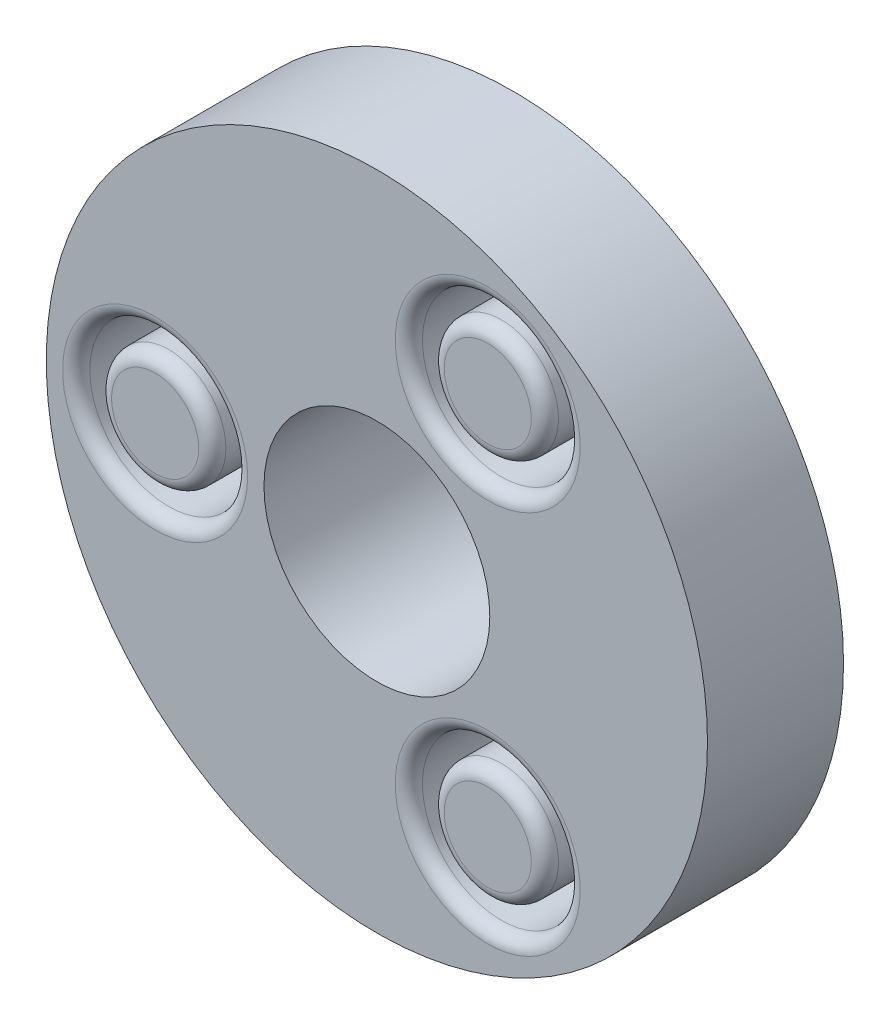
ISO-10303-21;
HEADER;
FILE_DESCRIPTION(('STEP AP214'),'2;1');
FILE_NAME('part.step','',(''),(''),'','','');
FILE_SCHEMA(('AUTOMOTIVE_DESIGN { 1 0 10303 214 1 1 1 1 }'));
ENDSEC;
DATA;
#1=APPLICATION_CONTEXT('core data for automotive mechanical design processes');
#2=APPLICATION_PROTOCOL_DEFINITION('international standard','automotive_design',2000,#1);
#3=PRODUCT_CONTEXT('',#1,'mechanical');
#4=PRODUCT('Part','Part','',(#3));
#5=PRODUCT_RELATED_PRODUCT_CATEGORY('part','',(#4));
#6=PRODUCT_DEFINITION_FORMATION('','',#4);
#7=PRODUCT_DEFINITION_CONTEXT('part definition',#1,'design');
#8=PRODUCT_DEFINITION('design','',#6,#7);
#9=PRODUCT_DEFINITION_SHAPE('','',#8);
#10=(LENGTH_UNIT() NAMED_UNIT(*) SI_UNIT(.MILLI.,.METRE.));
#11=(NAMED_UNIT(*) PLANE_ANGLE_UNIT() SI_UNIT($,.RADIAN.));
#12=(NAMED_UNIT(*) SI_UNIT($,.STERADIAN.) SOLID_ANGLE_UNIT());
#13=UNCERTAINTY_MEASURE_WITH_UNIT(LENGTH_MEASURE(1.E-05),#10,'distance_accuracy_value','');
#14=(GEOMETRIC_REPRESENTATION_CONTEXT(3) GLOBAL_UNCERTAINTY_ASSIGNED_CONTEXT((#13)) GLOBAL_UNIT_ASSIGNED_CONTEXT((#10,
#11,#12)) REPRESENTATION_CONTEXT('',''));
#15=CARTESIAN_POINT('',(0.,0.,0.));
#16=DIRECTION('',(0.,0.,1.));
#17=DIRECTION('',(1.,0.,0.));
#18=AXIS2_PLACEMENT_3D('',#15,#16,#17);
#19=CARTESIAN_POINT('',(0.,0.,0.));
#20=DIRECTION('',(0.,0.,1.));
#21=DIRECTION('',(1.,0.,0.));
#22=AXIS2_PLACEMENT_3D('',#19,#20,#21);
#23=PLANE('',#22);
#24=CARTESIAN_POINT('',(0.,0.,0.));
#25=DIRECTION('',(0.,0.,1.));
#26=DIRECTION('',(1.,0.,0.));
#27=AXIS2_PLACEMENT_3D('',#24,#25,#26);
#28=CIRCLE('',#27,6.);
#29=CARTESIAN_POINT('',(6.,0.,0.));
#30=VERTEX_POINT('',#29);
#31=EDGE_CURVE('E85',#30,#30,#28,.T.);
#32=ORIENTED_EDGE('',*,*,#31,.F.);
#33=EDGE_LOOP('',(#32));
#34=FACE_BOUND('',#33,.T.);
#35=CARTESIAN_POINT('',(0.,0.,0.));
#36=DIRECTION('',(0.,0.,1.));
#37=DIRECTION('',(1.,0.,0.));
#38=AXIS2_PLACEMENT_3D('',#35,#36,#37);
#39=CIRCLE('',#38,4.15);
#40=CARTESIAN_POINT('',(4.15,0.,0.));
#41=VERTEX_POINT('',#40);
#42=EDGE_CURVE('E88',#41,#41,#39,.T.);
#43=ORIENTED_EDGE('',*,*,#42,.T.);
#44=EDGE_LOOP('',(#43));
#45=FACE_BOUND('',#44,.T.);
#46=ADVANCED_FACE('F37',(#34,#45),#23,.F.);
#47=CARTESIAN_POINT('',(0.,0.,2.));
#48=DIRECTION('',(0.,0.,-1.));
#49=DIRECTION('',(-1.,0.,0.));
#50=AXIS2_PLACEMENT_3D('',#47,#48,#49);
#51=CYLINDRICAL_SURFACE('',#50,4.15);
#52=ORIENTED_EDGE('',*,*,#42,.F.);
#53=EDGE_LOOP('',(#52));
#54=FACE_BOUND('',#53,.T.);
#55=CARTESIAN_POINT('',(0.,0.,7.));
#56=DIRECTION('',(0.,0.,1.));
#57=DIRECTION('',(1.,0.,0.));
#58=AXIS2_PLACEMENT_3D('',#55,#56,#57);
#59=CIRCLE('',#58,4.15);
#60=CARTESIAN_POINT('',(4.15,0.,7.));
#61=VERTEX_POINT('',#60);
#62=EDGE_CURVE('E95',#61,#61,#59,.T.);
#63=ORIENTED_EDGE('',*,*,#62,.T.);
#64=EDGE_LOOP('',(#63));
#65=FACE_BOUND('',#64,.T.);
#66=ADVANCED_FACE('F140',(#54,#65),#51,.F.);
#67=CARTESIAN_POINT('',(0.,0.,7.));
#68=DIRECTION('',(0.,0.,1.));
#69=DIRECTION('',(1.,0.,0.));
#70=AXIS2_PLACEMENT_3D('',#67,#68,#69);
#71=PLANE('',#70);
#72=CARTESIAN_POINT('',(4.07499999999993,-7.05810704084321,7.));
#73=DIRECTION('',(0.,0.,1.));
#74=DIRECTION('',(1.,0.,0.));
#75=AXIS2_PLACEMENT_3D('',#72,#73,#74);
#76=CIRCLE('',#75,3.4);
#77=CARTESIAN_POINT('',(7.47499999999993,-7.05810704084321,7.));
#78=VERTEX_POINT('',#77);
#79=EDGE_CURVE('E73',#78,#78,#76,.F.);
#80=ORIENTED_EDGE('',*,*,#79,.T.);
#81=EDGE_LOOP('',(#80));
#82=FACE_BOUND('',#81,.T.);
#83=CARTESIAN_POINT('',(-8.15,0.,7.));
#84=DIRECTION('',(0.,0.,1.));
#85=DIRECTION('',(1.,0.,0.));
#86=AXIS2_PLACEMENT_3D('',#83,#84,#85);
#87=CIRCLE('',#86,3.4);
#88=CARTESIAN_POINT('',(-4.75,0.,7.));
#89=VERTEX_POINT('',#88);
#90=EDGE_CURVE('E76',#89,#89,#87,.F.);
#91=ORIENTED_EDGE('',*,*,#90,.T.);
#92=EDGE_LOOP('',(#91));
#93=FACE_BOUND('',#92,.T.);
#94=CARTESIAN_POINT('',(4.07500000000003,7.05810704084316,7.));
#95=DIRECTION('',(0.,0.,1.));
#96=DIRECTION('',(1.,0.,0.));
#97=AXIS2_PLACEMENT_3D('',#94,#95,#96);
#98=CIRCLE('',#97,3.4);
#99=CARTESIAN_POINT('',(7.47500000000003,7.05810704084316,7.));
#100=VERTEX_POINT('',#99);
#101=EDGE_CURVE('E79',#100,#100,#98,.F.);
#102=ORIENTED_EDGE('',*,*,#101,.T.);
#103=EDGE_LOOP('',(#102));
#104=FACE_BOUND('',#103,.T.);
#105=CARTESIAN_POINT('',(0.,0.,7.));
#106=DIRECTION('',(0.,0.,1.));
#107=DIRECTION('',(1.,0.,0.));
#108=AXIS2_PLACEMENT_3D('',#105,#106,#107);
#109=CIRCLE('',#108,12.15);
#110=CARTESIAN_POINT('',(12.15,0.,7.));
#111=VERTEX_POINT('',#110);
#112=EDGE_CURVE('E91',#111,#111,#109,.T.);
#113=ORIENTED_EDGE('',*,*,#112,.T.);
#114=EDGE_LOOP('',(#113));
#115=FACE_BOUND('',#114,.T.);
#116=ORIENTED_EDGE('',*,*,#62,.F.);
#117=EDGE_LOOP('',(#116));
#118=FACE_BOUND('',#117,.T.);
#119=ADVANCED_FACE('F146',(#82,#93,#104,#115,#118),#71,.T.);
#120=CARTESIAN_POINT('',(0.,0.,2.));
#121=DIRECTION('',(0.,0.,1.));
#122=DIRECTION('',(1.,0.,0.));
#123=AXIS2_PLACEMENT_3D('',#120,#121,#122);
#124=PLANE('',#123);
#125=CARTESIAN_POINT('',(0.,0.,2.));
#126=DIRECTION('',(0.,0.,1.));
#127=DIRECTION('',(1.,0.,0.));
#128=AXIS2_PLACEMENT_3D('',#125,#126,#127);
#129=CIRCLE('',#128,8.00000000000001);
#130=CARTESIAN_POINT('',(8.00000000000001,0.,2.));
#131=VERTEX_POINT('',#130);
#132=EDGE_CURVE('E10',#131,#131,#129,.T.);
#133=ORIENTED_EDGE('',*,*,#132,.T.);
#134=EDGE_LOOP('',(#133));
#135=FACE_BOUND('',#134,.T.);
#136=CARTESIAN_POINT('',(0.,0.,2.));
#137=DIRECTION('',(0.,0.,1.));
#138=DIRECTION('',(1.,0.,0.));
#139=AXIS2_PLACEMENT_3D('',#136,#137,#138);
#140=CIRCLE('',#139,12.15);
#141=CARTESIAN_POINT('',(12.15,0.,2.));
#142=VERTEX_POINT('',#141);
#143=EDGE_CURVE('E92',#142,#142,#140,.T.);
#144=ORIENTED_EDGE('',*,*,#143,.F.);
#145=EDGE_LOOP('',(#144));
#146=FACE_BOUND('',#145,.T.);
#147=ADVANCED_FACE('F194',(#135,#146),#124,.F.);
#148=CARTESIAN_POINT('',(0.,0.,7.));
#149=DIRECTION('',(0.,0.,-1.));
#150=DIRECTION('',(-1.,0.,0.));
#151=AXIS2_PLACEMENT_3D('',#148,#149,#150);
#152=CYLINDRICAL_SURFACE('',#151,12.15);
#153=ORIENTED_EDGE('',*,*,#112,.F.);
#154=EDGE_LOOP('',(#153));
#155=FACE_BOUND('',#154,.T.);
#156=ORIENTED_EDGE('',*,*,#143,.T.);
#157=EDGE_LOOP('',(#156));
#158=FACE_BOUND('',#157,.T.);
#159=ADVANCED_FACE('F199',(#155,#158),#152,.T.);
#160=CARTESIAN_POINT('',(4.07499999999993,-7.05810704084321,3.));
#161=DIRECTION('',(0.,0.,1.));
#162=DIRECTION('',(1.,0.,0.));
#163=AXIS2_PLACEMENT_3D('',#160,#161,#162);
#164=CYLINDRICAL_SURFACE('',#163,2.9);
#165=CARTESIAN_POINT('',(4.07499999999993,-7.05810704084321,6.5));
#166=DIRECTION('',(0.,0.,1.));
#167=DIRECTION('',(1.,0.,0.));
#168=AXIS2_PLACEMENT_3D('',#165,#166,#167);
#169=CIRCLE('',#168,2.9);
#170=CARTESIAN_POINT('',(6.97499999999993,-7.05810704084321,6.5));
#171=VERTEX_POINT('',#170);
#172=EDGE_CURVE('E82',#171,#171,#169,.T.);
#173=ORIENTED_EDGE('',*,*,#172,.T.);
#174=EDGE_LOOP('',(#173));
#175=FACE_BOUND('',#174,.T.);
#176=CARTESIAN_POINT('',(4.07499999999993,-7.05810704084321,3.));
#177=DIRECTION('',(0.,0.,1.));
#178=DIRECTION('',(1.,0.,0.));
#179=AXIS2_PLACEMENT_3D('',#176,#177,#178);
#180=CIRCLE('',#179,2.9);
#181=CARTESIAN_POINT('',(6.97499999999993,-7.05810704084321,3.));
#182=VERTEX_POINT('',#181);
#183=EDGE_CURVE('E105',#182,#182,#180,.T.);
#184=ORIENTED_EDGE('',*,*,#183,.F.);
#185=EDGE_LOOP('',(#184));
#186=FACE_BOUND('',#185,.T.);
#187=ADVANCED_FACE('F234',(#175,#186),#164,.F.);
#188=CARTESIAN_POINT('',(4.07499999999993,-7.05810704084321,3.));
#189=DIRECTION('',(0.,0.,1.));
#190=DIRECTION('',(1.,0.,0.));
#191=AXIS2_PLACEMENT_3D('',#188,#189,#190);
#192=PLANE('',#191);
#193=CARTESIAN_POINT('',(4.07499999999993,-7.05810704084321,3.));
#194=DIRECTION('',(0.,0.,1.));
#195=DIRECTION('',(1.,0.,0.));
#196=AXIS2_PLACEMENT_3D('',#193,#194,#195);
#197=CIRCLE('',#196,2.1);
#198=CARTESIAN_POINT('',(6.17499999999993,-7.05810704084321,3.));
#199=VERTEX_POINT('',#198);
#200=EDGE_CURVE('E101',#199,#199,#197,.T.);
#201=ORIENTED_EDGE('',*,*,#200,.F.);
#202=EDGE_LOOP('',(#201));
#203=FACE_BOUND('',#202,.T.);
#204=ORIENTED_EDGE('',*,*,#183,.T.);
#205=EDGE_LOOP('',(#204));
#206=FACE_BOUND('',#205,.T.);
#207=ADVANCED_FACE('F239',(#203,#206),#192,.T.);
#208=CARTESIAN_POINT('',(4.07499999999993,-7.05810704084321,3.));
#209=DIRECTION('',(0.,0.,1.));
#210=DIRECTION('',(1.,0.,0.));
#211=AXIS2_PLACEMENT_3D('',#208,#209,#210);
#212=CYLINDRICAL_SURFACE('',#211,2.1);
#213=CARTESIAN_POINT('',(4.07499999999993,-7.05810704084321,6.5));
#214=DIRECTION('',(0.,0.,1.));
#215=DIRECTION('',(1.,0.,0.));
#216=AXIS2_PLACEMENT_3D('',#213,#214,#215);
#217=CIRCLE('',#216,2.1);
#218=CARTESIAN_POINT('',(6.17499999999993,-7.05810704084321,6.5));
#219=VERTEX_POINT('',#218);
#220=EDGE_CURVE('E53',#219,#219,#217,.F.);
#221=ORIENTED_EDGE('',*,*,#220,.T.);
#222=EDGE_LOOP('',(#221));
#223=FACE_BOUND('',#222,.T.);
#224=ORIENTED_EDGE('',*,*,#200,.T.);
#225=EDGE_LOOP('',(#224));
#226=FACE_BOUND('',#225,.T.);
#227=ADVANCED_FACE('F250',(#223,#226),#212,.T.);
#228=CARTESIAN_POINT('',(4.07500000000003,7.05810704084316,3.));
#229=DIRECTION('',(0.,0.,1.));
#230=DIRECTION('',(1.,0.,0.));
#231=AXIS2_PLACEMENT_3D('',#228,#229,#230);
#232=CYLINDRICAL_SURFACE('',#231,2.9);
#233=CARTESIAN_POINT('',(4.07500000000003,7.05810704084316,6.5));
#234=DIRECTION('',(0.,0.,1.));
#235=DIRECTION('',(1.,0.,0.));
#236=AXIS2_PLACEMENT_3D('',#233,#234,#235);
#237=CIRCLE('',#236,2.9);
#238=CARTESIAN_POINT('',(6.97500000000004,7.05810704084316,6.5));
#239=VERTEX_POINT('',#238);
#240=EDGE_CURVE('E67',#239,#239,#237,.T.);
#241=ORIENTED_EDGE('',*,*,#240,.T.);
#242=EDGE_LOOP('',(#241));
#243=FACE_BOUND('',#242,.T.);
#244=CARTESIAN_POINT('',(4.07500000000003,7.05810704084316,3.));
#245=DIRECTION('',(0.,0.,1.));
#246=DIRECTION('',(1.,0.,0.));
#247=AXIS2_PLACEMENT_3D('',#244,#245,#246);
#248=CIRCLE('',#247,2.9);
#249=CARTESIAN_POINT('',(6.97500000000004,7.05810704084316,3.));
#250=VERTEX_POINT('',#249);
#251=EDGE_CURVE('E104',#250,#250,#248,.T.);
#252=ORIENTED_EDGE('',*,*,#251,.F.);
#253=EDGE_LOOP('',(#252));
#254=FACE_BOUND('',#253,.T.);
#255=ADVANCED_FACE('F255',(#243,#254),#232,.F.);
#256=CARTESIAN_POINT('',(4.07500000000003,7.05810704084316,3.));
#257=DIRECTION('',(0.,0.,1.));
#258=DIRECTION('',(1.,0.,0.));
#259=AXIS2_PLACEMENT_3D('',#256,#257,#258);
#260=PLANE('',#259);
#261=CARTESIAN_POINT('',(4.07500000000003,7.05810704084316,3.));
#262=DIRECTION('',(0.,0.,1.));
#263=DIRECTION('',(1.,0.,0.));
#264=AXIS2_PLACEMENT_3D('',#261,#262,#263);
#265=CIRCLE('',#264,2.1);
#266=CARTESIAN_POINT('',(6.17500000000004,7.05810704084316,3.));
#267=VERTEX_POINT('',#266);
#268=EDGE_CURVE('E108',#267,#267,#265,.T.);
#269=ORIENTED_EDGE('',*,*,#268,.F.);
#270=EDGE_LOOP('',(#269));
#271=FACE_BOUND('',#270,.T.);
#272=ORIENTED_EDGE('',*,*,#251,.T.);
#273=EDGE_LOOP('',(#272));
#274=FACE_BOUND('',#273,.T.);
#275=ADVANCED_FACE('F135',(#271,#274),#260,.T.);
#276=CARTESIAN_POINT('',(4.07500000000003,7.05810704084316,3.));
#277=DIRECTION('',(0.,0.,1.));
#278=DIRECTION('',(1.,0.,0.));
#279=AXIS2_PLACEMENT_3D('',#276,#277,#278);
#280=CYLINDRICAL_SURFACE('',#279,2.1);
#281=CARTESIAN_POINT('',(4.07500000000003,7.05810704084316,6.5));
#282=DIRECTION('',(0.,0.,1.));
#283=DIRECTION('',(1.,0.,0.));
#284=AXIS2_PLACEMENT_3D('',#281,#282,#283);
#285=CIRCLE('',#284,2.1);
#286=CARTESIAN_POINT('',(6.17500000000004,7.05810704084316,6.5));
#287=VERTEX_POINT('',#286);
#288=EDGE_CURVE('E61',#287,#287,#285,.F.);
#289=ORIENTED_EDGE('',*,*,#288,.T.);
#290=EDGE_LOOP('',(#289));
#291=FACE_BOUND('',#290,.T.);
#292=ORIENTED_EDGE('',*,*,#268,.T.);
#293=EDGE_LOOP('',(#292));
#294=FACE_BOUND('',#293,.T.);
#295=ADVANCED_FACE('F129',(#291,#294),#280,.T.);
#296=CARTESIAN_POINT('',(-8.15,0.,3.));
#297=DIRECTION('',(0.,0.,1.));
#298=DIRECTION('',(1.,0.,0.));
#299=AXIS2_PLACEMENT_3D('',#296,#297,#298);
#300=CYLINDRICAL_SURFACE('',#299,2.9);
#301=CARTESIAN_POINT('',(-8.15,0.,6.5));
#302=DIRECTION('',(0.,0.,1.));
#303=DIRECTION('',(1.,0.,0.));
#304=AXIS2_PLACEMENT_3D('',#301,#302,#303);
#305=CIRCLE('',#304,2.9);
#306=CARTESIAN_POINT('',(-5.25,0.,6.5));
#307=VERTEX_POINT('',#306);
#308=EDGE_CURVE('E70',#307,#307,#305,.T.);
#309=ORIENTED_EDGE('',*,*,#308,.T.);
#310=EDGE_LOOP('',(#309));
#311=FACE_BOUND('',#310,.T.);
#312=CARTESIAN_POINT('',(-8.15,0.,3.));
#313=DIRECTION('',(0.,0.,1.));
#314=DIRECTION('',(1.,0.,0.));
#315=AXIS2_PLACEMENT_3D('',#312,#313,#314);
#316=CIRCLE('',#315,2.9);
#317=CARTESIAN_POINT('',(-5.25,0.,3.));
#318=VERTEX_POINT('',#317);
#319=EDGE_CURVE('E100',#318,#318,#316,.T.);
#320=ORIENTED_EDGE('',*,*,#319,.F.);
#321=EDGE_LOOP('',(#320));
#322=FACE_BOUND('',#321,.T.);
#323=ADVANCED_FACE('F124',(#311,#322),#300,.F.);
#324=CARTESIAN_POINT('',(-8.15,0.,3.));
#325=DIRECTION('',(0.,0.,1.));
#326=DIRECTION('',(1.,0.,0.));
#327=AXIS2_PLACEMENT_3D('',#324,#325,#326);
#328=PLANE('',#327);
#329=CARTESIAN_POINT('',(-8.15,0.,3.));
#330=DIRECTION('',(0.,0.,1.));
#331=DIRECTION('',(1.,0.,0.));
#332=AXIS2_PLACEMENT_3D('',#329,#330,#331);
#333=CIRCLE('',#332,2.1);
#334=CARTESIAN_POINT('',(-6.05,0.,3.));
#335=VERTEX_POINT('',#334);
#336=EDGE_CURVE('E111',#335,#335,#333,.T.);
#337=ORIENTED_EDGE('',*,*,#336,.F.);
#338=EDGE_LOOP('',(#337));
#339=FACE_BOUND('',#338,.T.);
#340=ORIENTED_EDGE('',*,*,#319,.T.);
#341=EDGE_LOOP('',(#340));
#342=FACE_BOUND('',#341,.T.);
#343=ADVANCED_FACE('F121',(#339,#342),#328,.T.);
#344=CARTESIAN_POINT('',(-8.15,0.,3.));
#345=DIRECTION('',(0.,0.,1.));
#346=DIRECTION('',(1.,0.,0.));
#347=AXIS2_PLACEMENT_3D('',#344,#345,#346);
#348=CYLINDRICAL_SURFACE('',#347,2.1);
#349=CARTESIAN_POINT('',(-8.15,0.,6.5));
#350=DIRECTION('',(0.,0.,1.));
#351=DIRECTION('',(1.,0.,0.));
#352=AXIS2_PLACEMENT_3D('',#349,#350,#351);
#353=CIRCLE('',#352,2.1);
#354=CARTESIAN_POINT('',(-6.05,0.,6.5));
#355=VERTEX_POINT('',#354);
#356=EDGE_CURVE('E45',#355,#355,#353,.F.);
#357=ORIENTED_EDGE('',*,*,#356,.T.);
#358=EDGE_LOOP('',(#357));
#359=FACE_BOUND('',#358,.T.);
#360=ORIENTED_EDGE('',*,*,#336,.T.);
#361=EDGE_LOOP('',(#360));
#362=FACE_BOUND('',#361,.T.);
#363=ADVANCED_FACE('F119',(#359,#362),#348,.T.);
#364=CARTESIAN_POINT('',(4.07499999999993,-7.05810704084321,7.));
#365=DIRECTION('',(0.,0.,1.));
#366=DIRECTION('',(1.,0.,0.));
#367=AXIS2_PLACEMENT_3D('',#364,#365,#366);
#368=CIRCLE('',#367,1.6);
#369=CARTESIAN_POINT('',(5.67499999999993,-7.05810704084321,7.));
#370=VERTEX_POINT('',#369);
#371=EDGE_CURVE('E58',#370,#370,#368,.T.);
#372=ORIENTED_EDGE('',*,*,#371,.T.);
#373=EDGE_LOOP('',(#372));
#374=FACE_BOUND('',#373,.T.);
#375=ADVANCED_FACE('F189',(#374),#71,.T.);
#376=CARTESIAN_POINT('',(4.07500000000003,7.05810704084316,7.));
#377=DIRECTION('',(0.,0.,1.));
#378=DIRECTION('',(1.,0.,0.));
#379=AXIS2_PLACEMENT_3D('',#376,#377,#378);
#380=CIRCLE('',#379,1.6);
#381=CARTESIAN_POINT('',(5.67500000000004,7.05810704084316,7.));
#382=VERTEX_POINT('',#381);
#383=EDGE_CURVE('E64',#382,#382,#380,.T.);
#384=ORIENTED_EDGE('',*,*,#383,.T.);
#385=EDGE_LOOP('',(#384));
#386=FACE_BOUND('',#385,.T.);
#387=ADVANCED_FACE('F184',(#386),#71,.T.);
#388=CARTESIAN_POINT('',(-8.15,0.,7.));
#389=DIRECTION('',(0.,0.,1.));
#390=DIRECTION('',(1.,0.,0.));
#391=AXIS2_PLACEMENT_3D('',#388,#389,#390);
#392=CIRCLE('',#391,1.6);
#393=CARTESIAN_POINT('',(-6.55,0.,7.));
#394=VERTEX_POINT('',#393);
#395=EDGE_CURVE('E49',#394,#394,#392,.T.);
#396=ORIENTED_EDGE('',*,*,#395,.T.);
#397=EDGE_LOOP('',(#396));
#398=FACE_BOUND('',#397,.T.);
#399=ADVANCED_FACE('F157',(#398),#71,.T.);
#400=CARTESIAN_POINT('',(4.07499999999993,-7.05810704084321,6.5));
#401=DIRECTION('',(0.,0.,1.));
#402=DIRECTION('',(1.,0.,0.));
#403=AXIS2_PLACEMENT_3D('',#400,#401,#402);
#404=TOROIDAL_SURFACE('',#403,3.4,0.5);
#405=ORIENTED_EDGE('',*,*,#79,.F.);
#406=EDGE_LOOP('',(#405));
#407=FACE_BOUND('',#406,.T.);
#408=ORIENTED_EDGE('',*,*,#172,.F.);
#409=EDGE_LOOP('',(#408));
#410=FACE_BOUND('',#409,.T.);
#411=ADVANCED_FACE('F153',(#407,#410),#404,.T.);
#412=CARTESIAN_POINT('',(-8.15,0.,6.5));
#413=DIRECTION('',(0.,0.,1.));
#414=DIRECTION('',(1.,0.,0.));
#415=AXIS2_PLACEMENT_3D('',#412,#413,#414);
#416=TOROIDAL_SURFACE('',#415,3.4,0.5);
#417=ORIENTED_EDGE('',*,*,#90,.F.);
#418=EDGE_LOOP('',(#417));
#419=FACE_BOUND('',#418,.T.);
#420=ORIENTED_EDGE('',*,*,#308,.F.);
#421=EDGE_LOOP('',(#420));
#422=FACE_BOUND('',#421,.T.);
#423=ADVANCED_FACE('F156',(#419,#422),#416,.T.);
#424=CARTESIAN_POINT('',(4.07500000000003,7.05810704084316,6.5));
#425=DIRECTION('',(0.,0.,1.));
#426=DIRECTION('',(1.,0.,0.));
#427=AXIS2_PLACEMENT_3D('',#424,#425,#426);
#428=TOROIDAL_SURFACE('',#427,3.4,0.5);
#429=ORIENTED_EDGE('',*,*,#101,.F.);
#430=EDGE_LOOP('',(#429));
#431=FACE_BOUND('',#430,.T.);
#432=ORIENTED_EDGE('',*,*,#240,.F.);
#433=EDGE_LOOP('',(#432));
#434=FACE_BOUND('',#433,.T.);
#435=ADVANCED_FACE('F161',(#431,#434),#428,.T.);
#436=CARTESIAN_POINT('',(4.07500000000003,7.05810704084316,6.5));
#437=DIRECTION('',(0.,0.,1.));
#438=DIRECTION('',(1.,0.,0.));
#439=AXIS2_PLACEMENT_3D('',#436,#437,#438);
#440=TOROIDAL_SURFACE('',#439,1.6,0.5);
#441=ORIENTED_EDGE('',*,*,#288,.F.);
#442=EDGE_LOOP('',(#441));
#443=FACE_BOUND('',#442,.T.);
#444=ORIENTED_EDGE('',*,*,#383,.F.);
#445=EDGE_LOOP('',(#444));
#446=FACE_BOUND('',#445,.T.);
#447=ADVANCED_FACE('F165',(#443,#446),#440,.T.);
#448=CARTESIAN_POINT('',(4.07499999999993,-7.05810704084321,6.5));
#449=DIRECTION('',(0.,0.,1.));
#450=DIRECTION('',(1.,0.,0.));
#451=AXIS2_PLACEMENT_3D('',#448,#449,#450);
#452=TOROIDAL_SURFACE('',#451,1.6,0.5);
#453=ORIENTED_EDGE('',*,*,#220,.F.);
#454=EDGE_LOOP('',(#453));
#455=FACE_BOUND('',#454,.T.);
#456=ORIENTED_EDGE('',*,*,#371,.F.);
#457=EDGE_LOOP('',(#456));
#458=FACE_BOUND('',#457,.T.);
#459=ADVANCED_FACE('F169',(#455,#458),#452,.T.);
#460=CARTESIAN_POINT('',(-8.15,0.,6.5));
#461=DIRECTION('',(0.,0.,1.));
#462=DIRECTION('',(1.,0.,0.));
#463=AXIS2_PLACEMENT_3D('',#460,#461,#462);
#464=TOROIDAL_SURFACE('',#463,1.6,0.5);
#465=ORIENTED_EDGE('',*,*,#356,.F.);
#466=EDGE_LOOP('',(#465));
#467=FACE_BOUND('',#466,.T.);
#468=ORIENTED_EDGE('',*,*,#395,.F.);
#469=EDGE_LOOP('',(#468));
#470=FACE_BOUND('',#469,.T.);
#471=ADVANCED_FACE('F172',(#467,#470),#464,.T.);
#472=CARTESIAN_POINT('',(0.,0.,2.));
#473=DIRECTION('',(0.,0.,1.));
#474=DIRECTION('',(1.,0.,0.));
#475=AXIS2_PLACEMENT_3D('',#472,#473,#474);
#476=CONICAL_SURFACE('',#475,8.00000000000001,0.785398163397453);
#477=ORIENTED_EDGE('',*,*,#31,.T.);
#478=EDGE_LOOP('',(#477));
#479=FACE_BOUND('',#478,.T.);
#480=ORIENTED_EDGE('',*,*,#132,.F.);
#481=EDGE_LOOP('',(#480));
#482=FACE_BOUND('',#481,.T.);
#483=ADVANCED_FACE('F40',(#479,#482),#476,.T.);
#484=CLOSED_SHELL('',(#46,#66,#119,#147,#159,#187,#207,#227,#255,#275,#295,#323,#343,#363,#375,
#387,#399,#411,#423,#435,#447,#459,#471,#483));
#485=MANIFOLD_SOLID_BREP('B2',#484);
#486=ADVANCED_BREP_SHAPE_REPRESENTATION('',(#18,#485),#14);
#487=SHAPE_DEFINITION_REPRESENTATION(#9,#486);
ENDSEC;
END-ISO-10303-21;
